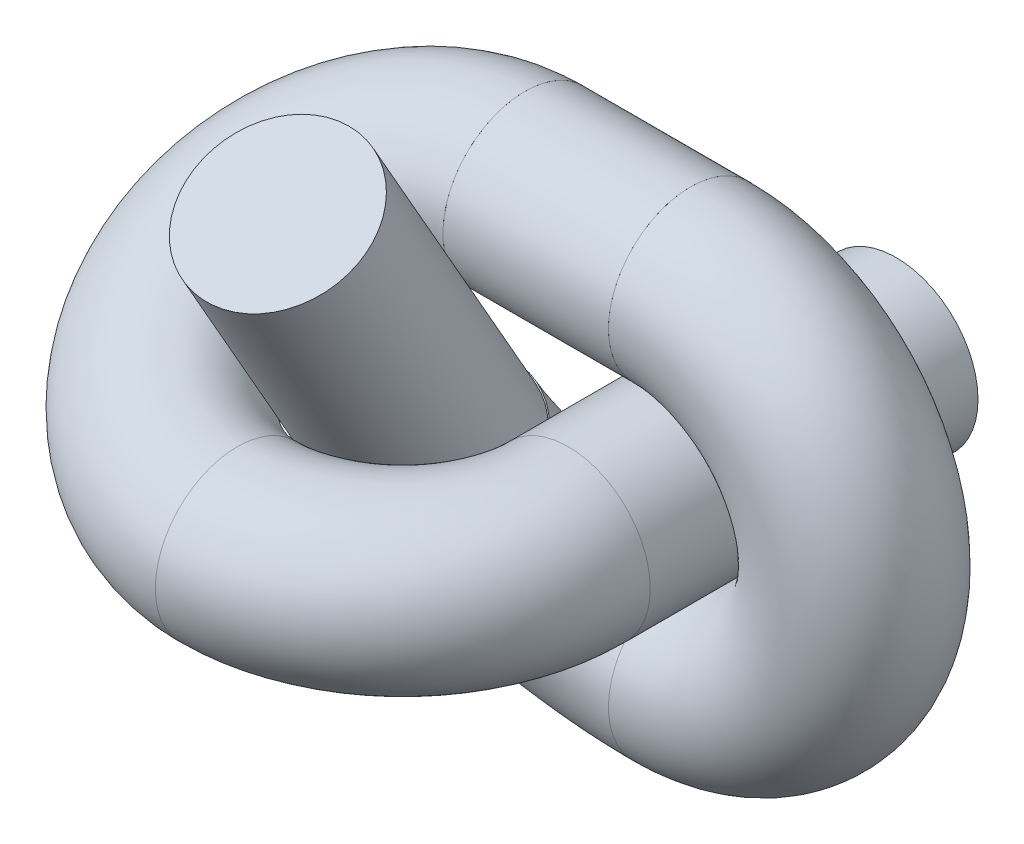
ISO-10303-21;
HEADER;
FILE_DESCRIPTION(('STEP AP214'),'2;1');
FILE_NAME('part.step','',(''),(''),'','','');
FILE_SCHEMA(('AUTOMOTIVE_DESIGN { 1 0 10303 214 1 1 1 1 }'));
ENDSEC;
DATA;
#1=APPLICATION_CONTEXT('core data for automotive mechanical design processes');
#2=APPLICATION_PROTOCOL_DEFINITION('international standard','automotive_design',2000,#1);
#3=PRODUCT_CONTEXT('',#1,'mechanical');
#4=PRODUCT('Part','Part','',(#3));
#5=PRODUCT_RELATED_PRODUCT_CATEGORY('part','',(#4));
#6=PRODUCT_DEFINITION_FORMATION('','',#4);
#7=PRODUCT_DEFINITION_CONTEXT('part definition',#1,'design');
#8=PRODUCT_DEFINITION('design','',#6,#7);
#9=PRODUCT_DEFINITION_SHAPE('','',#8);
#10=(LENGTH_UNIT() NAMED_UNIT(*) SI_UNIT(.MILLI.,.METRE.));
#11=(NAMED_UNIT(*) PLANE_ANGLE_UNIT() SI_UNIT($,.RADIAN.));
#12=(NAMED_UNIT(*) SI_UNIT($,.STERADIAN.) SOLID_ANGLE_UNIT());
#13=UNCERTAINTY_MEASURE_WITH_UNIT(LENGTH_MEASURE(1.E-05),#10,'distance_accuracy_value','');
#14=(GEOMETRIC_REPRESENTATION_CONTEXT(3) GLOBAL_UNCERTAINTY_ASSIGNED_CONTEXT((#13)) GLOBAL_UNIT_ASSIGNED_CONTEXT((#10,
#11,#12)) REPRESENTATION_CONTEXT('',''));
#15=CARTESIAN_POINT('',(0.,0.,0.));
#16=DIRECTION('',(0.,0.,1.));
#17=DIRECTION('',(1.,0.,0.));
#18=AXIS2_PLACEMENT_3D('',#15,#16,#17);
#19=CARTESIAN_POINT('',(-5.05,-0.662667760917116,8.86025271609244));
#20=DIRECTION('',(0.,0.868864769482725,0.495049504950495));
#21=DIRECTION('',(0.,-0.495049504950495,0.868864769482726));
#22=AXIS2_PLACEMENT_3D('',#19,#20,#21);
#23=CYLINDRICAL_SURFACE('',#22,2.5);
#24=CARTESIAN_POINT('',(-5.05,-0.662667760917116,8.86025271609244));
#25=DIRECTION('',(0.,-0.868864769482726,-0.495049504950495));
#26=DIRECTION('',(0.,0.495049504950495,-0.868864769482726));
#27=AXIS2_PLACEMENT_3D('',#24,#25,#26);
#28=CIRCLE('',#27,2.5);
#29=CARTESIAN_POINT('',(-5.05,0.574956001459122,6.68809079238562));
#30=VERTEX_POINT('',#29);
#31=EDGE_CURVE('E12',#30,#30,#28,.T.);
#32=ORIENTED_EDGE('',*,*,#31,.F.);
#33=EDGE_LOOP('',(#32));
#34=FACE_BOUND('',#33,.T.);
#35=CARTESIAN_POINT('',(-5.05,8.02597993391014,13.8107477655974));
#36=DIRECTION('',(0.,-0.868864769482726,-0.495049504950495));
#37=DIRECTION('',(0.,0.495049504950495,-0.868864769482726));
#38=AXIS2_PLACEMENT_3D('',#35,#36,#37);
#39=CIRCLE('',#38,2.5);
#40=CARTESIAN_POINT('',(-5.05,9.26360369628638,11.6385858418906));
#41=VERTEX_POINT('',#40);
#42=EDGE_CURVE('E57',#41,#41,#39,.T.);
#43=ORIENTED_EDGE('',*,*,#42,.T.);
#44=EDGE_LOOP('',(#43));
#45=FACE_BOUND('',#44,.T.);
#46=ADVANCED_FACE('F51',(#34,#45),#23,.T.);
#47=CARTESIAN_POINT('',(-5.05,-0.662667760917116,8.86025271609244));
#48=DIRECTION('',(0.,-0.868864769482726,-0.495049504950495));
#49=DIRECTION('',(0.,0.495049504950495,-0.868864769482726));
#50=AXIS2_PLACEMENT_3D('',#47,#48,#49);
#51=PLANE('',#50);
#52=ORIENTED_EDGE('',*,*,#31,.T.);
#53=EDGE_LOOP('',(#52));
#54=FACE_BOUND('',#53,.T.);
#55=ADVANCED_FACE('F66',(#54),#51,.T.);
#56=CARTESIAN_POINT('',(-5.05,8.02597993391014,13.8107477655974));
#57=DIRECTION('',(0.,-0.868864769482726,-0.495049504950495));
#58=DIRECTION('',(0.,0.495049504950495,-0.868864769482726));
#59=AXIS2_PLACEMENT_3D('',#56,#57,#58);
#60=PLANE('',#59);
#61=ORIENTED_EDGE('',*,*,#42,.F.);
#62=EDGE_LOOP('',(#61));
#63=FACE_BOUND('',#62,.T.);
#64=ADVANCED_FACE('F64',(#63),#60,.F.);
#65=CLOSED_SHELL('',(#46,#55,#64));
#66=MANIFOLD_SOLID_BREP('B2',#65);
#67=CARTESIAN_POINT('',(0.,5.,6.27446582822447));
#68=DIRECTION('',(1.,0.,0.));
#69=DIRECTION('',(0.,0.,-1.));
#70=AXIS2_PLACEMENT_3D('',#67,#68,#69);
#71=PLANE('',#70);
#72=CARTESIAN_POINT('',(0.,5.,6.27446582822447));
#73=DIRECTION('',(1.,0.,0.));
#74=DIRECTION('',(0.,0.,-1.));
#75=AXIS2_PLACEMENT_3D('',#72,#73,#74);
#76=CIRCLE('',#75,2.5);
#77=CARTESIAN_POINT('',(0.,7.5,6.27446582822447));
#78=VERTEX_POINT('',#77);
#79=EDGE_CURVE('E106',#78,#78,#76,.T.);
#80=ORIENTED_EDGE('',*,*,#79,.F.);
#81=EDGE_LOOP('',(#80));
#82=FACE_BOUND('',#81,.T.);
#83=ADVANCED_FACE('F100',(#82),#71,.F.);
#84=CARTESIAN_POINT('',(0.,0.,6.27446582822447));
#85=DIRECTION('',(0.,0.,-1.));
#86=DIRECTION('',(-1.,0.,0.));
#87=AXIS2_PLACEMENT_3D('',#84,#85,#86);
#88=TOROIDAL_SURFACE('',#87,5.,2.5);
#89=CARTESIAN_POINT('',(0.,-5.,6.27446582822447));
#90=DIRECTION('',(-1.,0.,0.));
#91=DIRECTION('',(0.,0.,-1.));
#92=AXIS2_PLACEMENT_3D('',#89,#90,#91);
#93=CIRCLE('',#92,2.5);
#94=CARTESIAN_POINT('',(0.,-7.5,6.27446582822447));
#95=VERTEX_POINT('',#94);
#96=EDGE_CURVE('E50',#95,#95,#93,.T.);
#97=CARTESIAN_POINT('',(0.,0.,6.27446582822447));
#98=DIRECTION('',(0.,0.,-1.));
#99=DIRECTION('',(-1.,0.,0.));
#100=AXIS2_PLACEMENT_3D('',#97,#98,#99);
#101=CIRCLE('',#100,7.5);
#102=EDGE_CURVE('',#78,#95,#101,.T.);
#103=ORIENTED_EDGE('',*,*,#79,.T.);
#104=ORIENTED_EDGE('',*,*,#96,.F.);
#105=ORIENTED_EDGE('',*,*,#102,.T.);
#106=ORIENTED_EDGE('',*,*,#102,.F.);
#107=EDGE_LOOP('',(#103,#105,#104,#106));
#108=FACE_BOUND('',#107,.T.);
#109=ADVANCED_FACE('F125',(#108),#88,.T.);
#110=CARTESIAN_POINT('',(-5.05,-0.64114948311499,8.82454860559686));
#111=DIRECTION('',(0.,0.863138716214854,0.504966886608394));
#112=DIRECTION('',(-0.863138716214853,-0.254991556570975,0.435856470238181));
#113=AXIS2_PLACEMENT_3D('',#110,#111,#112);
#114=PLANE('',#113);
#115=CARTESIAN_POINT('',(-5.05,-0.64114948311499,8.82454860559686));
#116=DIRECTION('',(0.,0.863138716214854,0.504966886608394));
#117=DIRECTION('',(-0.863138716214853,-0.254991556570975,0.435856470238181));
#118=AXIS2_PLACEMENT_3D('',#115,#116,#117);
#119=CIRCLE('',#118,2.5);
#120=CARTESIAN_POINT('',(-7.20784679053713,-1.27862837454243,9.91418978119231));
#121=VERTEX_POINT('',#120);
#122=EDGE_CURVE('E110',#121,#121,#119,.T.);
#123=ORIENTED_EDGE('',*,*,#122,.T.);
#124=EDGE_LOOP('',(#123));
#125=FACE_BOUND('',#124,.T.);
#126=ADVANCED_FACE('F117',(#125),#114,.T.);
#127=CARTESIAN_POINT('',(0.,-0.64114948311499,8.82454860559686));
#128=DIRECTION('',(0.,-0.504966886608394,0.863138716214854));
#129=DIRECTION('',(0.,-0.863138716214854,-0.504966886608394));
#130=AXIS2_PLACEMENT_3D('',#127,#128,#129);
#131=TOROIDAL_SURFACE('',#130,5.05,2.5);
#132=ORIENTED_EDGE('',*,*,#96,.T.);
#133=EDGE_LOOP('',(#132));
#134=FACE_BOUND('',#133,.T.);
#135=ORIENTED_EDGE('',*,*,#122,.F.);
#136=EDGE_LOOP('',(#135));
#137=FACE_BOUND('',#136,.T.);
#138=ADVANCED_FACE('F119',(#134,#137),#131,.T.);
#139=CLOSED_SHELL('',(#83,#109,#126,#138));
#140=MANIFOLD_SOLID_BREP('B7',#139);
#141=CARTESIAN_POINT('',(-5.05,5.,6.27446582822447));
#142=DIRECTION('',(1.,0.,0.));
#143=DIRECTION('',(0.,0.,-1.));
#144=AXIS2_PLACEMENT_3D('',#141,#142,#143);
#145=CYLINDRICAL_SURFACE('',#144,2.5);
#146=CARTESIAN_POINT('',(-5.05,5.,6.27446582822447));
#147=DIRECTION('',(1.,0.,0.));
#148=DIRECTION('',(0.,0.,-1.));
#149=AXIS2_PLACEMENT_3D('',#146,#147,#148);
#150=CIRCLE('',#149,2.5);
#151=CARTESIAN_POINT('',(-5.05,5.,3.77446582822447));
#152=VERTEX_POINT('',#151);
#153=EDGE_CURVE('E99',#152,#152,#150,.T.);
#154=ORIENTED_EDGE('',*,*,#153,.T.);
#155=EDGE_LOOP('',(#154));
#156=FACE_BOUND('',#155,.T.);
#157=CARTESIAN_POINT('',(0.,5.,6.27446582822447));
#158=DIRECTION('',(1.,0.,0.));
#159=DIRECTION('',(0.,0.,-1.));
#160=AXIS2_PLACEMENT_3D('',#157,#158,#159);
#161=CIRCLE('',#160,2.5);
#162=CARTESIAN_POINT('',(0.,5.,3.77446582822447));
#163=VERTEX_POINT('',#162);
#164=EDGE_CURVE('E166',#163,#163,#161,.T.);
#165=ORIENTED_EDGE('',*,*,#164,.F.);
#166=EDGE_LOOP('',(#165));
#167=FACE_BOUND('',#166,.T.);
#168=ADVANCED_FACE('F163',(#156,#167),#145,.T.);
#169=CARTESIAN_POINT('',(-5.05,5.,6.27446582822447));
#170=DIRECTION('',(1.,0.,0.));
#171=DIRECTION('',(0.,0.,-1.));
#172=AXIS2_PLACEMENT_3D('',#169,#170,#171);
#173=PLANE('',#172);
#174=ORIENTED_EDGE('',*,*,#153,.F.);
#175=EDGE_LOOP('',(#174));
#176=FACE_BOUND('',#175,.T.);
#177=ADVANCED_FACE('F178',(#176),#173,.F.);
#178=CARTESIAN_POINT('',(0.,5.,6.27446582822447));
#179=DIRECTION('',(1.,0.,0.));
#180=DIRECTION('',(0.,0.,-1.));
#181=AXIS2_PLACEMENT_3D('',#178,#179,#180);
#182=PLANE('',#181);
#183=ORIENTED_EDGE('',*,*,#164,.T.);
#184=EDGE_LOOP('',(#183));
#185=FACE_BOUND('',#184,.T.);
#186=ADVANCED_FACE('F175',(#185),#182,.T.);
#187=CLOSED_SHELL('',(#168,#177,#186));
#188=MANIFOLD_SOLID_BREP('B45',#187);
#189=CARTESIAN_POINT('',(0.,0.,10.));
#190=DIRECTION('',(0.,0.,-1.));
#191=DIRECTION('',(-1.,0.,0.));
#192=AXIS2_PLACEMENT_3D('',#189,#190,#191);
#193=CYLINDRICAL_SURFACE('',#192,2.5);
#194=CARTESIAN_POINT('',(0.,0.,10.));
#195=DIRECTION('',(0.,0.,1.));
#196=DIRECTION('',(1.,0.,0.));
#197=AXIS2_PLACEMENT_3D('',#194,#195,#196);
#198=CIRCLE('',#197,2.5);
#199=CARTESIAN_POINT('',(2.5,0.,10.));
#200=VERTEX_POINT('',#199);
#201=EDGE_CURVE('E162',#200,#200,#198,.T.);
#202=ORIENTED_EDGE('',*,*,#201,.F.);
#203=EDGE_LOOP('',(#202));
#204=FACE_BOUND('',#203,.T.);
#205=CARTESIAN_POINT('',(0.,0.,0.));
#206=DIRECTION('',(0.,0.,1.));
#207=DIRECTION('',(1.,0.,0.));
#208=AXIS2_PLACEMENT_3D('',#205,#206,#207);
#209=CIRCLE('',#208,2.5);
#210=CARTESIAN_POINT('',(2.5,0.,0.));
#211=VERTEX_POINT('',#210);
#212=EDGE_CURVE('E212',#211,#211,#209,.T.);
#213=ORIENTED_EDGE('',*,*,#212,.T.);
#214=EDGE_LOOP('',(#213));
#215=FACE_BOUND('',#214,.T.);
#216=ADVANCED_FACE('F204',(#204,#215),#193,.T.);
#217=CARTESIAN_POINT('',(0.,0.,0.));
#218=DIRECTION('',(0.,0.,1.));
#219=DIRECTION('',(1.,0.,0.));
#220=AXIS2_PLACEMENT_3D('',#217,#218,#219);
#221=PLANE('',#220);
#222=ORIENTED_EDGE('',*,*,#212,.F.);
#223=EDGE_LOOP('',(#222));
#224=FACE_BOUND('',#223,.T.);
#225=ADVANCED_FACE('F233',(#224),#221,.F.);
#226=CARTESIAN_POINT('',(-5.05,0.,10.));
#227=DIRECTION('',(0.,1.,0.));
#228=DIRECTION('',(0.,0.,1.));
#229=AXIS2_PLACEMENT_3D('',#226,#227,#228);
#230=TOROIDAL_SURFACE('',#229,5.05,2.5);
#231=CARTESIAN_POINT('',(-5.05,0.,15.05));
#232=DIRECTION('',(-1.,0.,0.));
#233=DIRECTION('',(0.,0.,1.));
#234=AXIS2_PLACEMENT_3D('',#231,#232,#233);
#235=CIRCLE('',#234,2.5);
#236=CARTESIAN_POINT('',(-5.05,0.,17.55));
#237=VERTEX_POINT('',#236);
#238=EDGE_CURVE('E207',#237,#237,#235,.T.);
#239=CARTESIAN_POINT('',(-5.05,0.,10.));
#240=DIRECTION('',(0.,1.,0.));
#241=DIRECTION('',(0.,0.,1.));
#242=AXIS2_PLACEMENT_3D('',#239,#240,#241);
#243=CIRCLE('',#242,7.55);
#244=EDGE_CURVE('',#237,#200,#243,.T.);
#245=ORIENTED_EDGE('',*,*,#238,.F.);
#246=ORIENTED_EDGE('',*,*,#201,.T.);
#247=ORIENTED_EDGE('',*,*,#244,.T.);
#248=ORIENTED_EDGE('',*,*,#244,.F.);
#249=EDGE_LOOP('',(#245,#247,#246,#248));
#250=FACE_BOUND('',#249,.T.);
#251=ADVANCED_FACE('F230',(#250),#230,.T.);
#252=CARTESIAN_POINT('',(-5.05,5.,6.27446582822447));
#253=DIRECTION('',(1.,0.,0.));
#254=DIRECTION('',(0.,0.860262148002699,-0.509851975296539));
#255=AXIS2_PLACEMENT_3D('',#252,#253,#254);
#256=PLANE('',#255);
#257=CARTESIAN_POINT('',(-5.05,5.,6.27446582822447));
#258=DIRECTION('',(1.,0.,0.));
#259=DIRECTION('',(0.,0.860262148002699,-0.509851975296539));
#260=AXIS2_PLACEMENT_3D('',#257,#258,#259);
#261=CIRCLE('',#260,2.5);
#262=CARTESIAN_POINT('',(-5.05,7.15065537000675,4.99983588998313));
#263=VERTEX_POINT('',#262);
#264=EDGE_CURVE('E219',#263,#263,#261,.T.);
#265=ORIENTED_EDGE('',*,*,#264,.T.);
#266=EDGE_LOOP('',(#265));
#267=FACE_BOUND('',#266,.T.);
#268=ADVANCED_FACE('F232',(#267),#256,.T.);
#269=CARTESIAN_POINT('',(-5.05,2.5,10.6622329141122));
#270=DIRECTION('',(0.,-0.868864769482726,-0.495049504950495));
#271=DIRECTION('',(0.,0.495049504950495,-0.868864769482726));
#272=AXIS2_PLACEMENT_3D('',#269,#270,#271);
#273=TOROIDAL_SURFACE('',#272,5.05,2.5);
#274=ORIENTED_EDGE('',*,*,#264,.F.);
#275=EDGE_LOOP('',(#274));
#276=FACE_BOUND('',#275,.T.);
#277=ORIENTED_EDGE('',*,*,#238,.T.);
#278=EDGE_LOOP('',(#277));
#279=FACE_BOUND('',#278,.T.);
#280=ADVANCED_FACE('F228',(#276,#279),#273,.T.);
#281=CLOSED_SHELL('',(#216,#225,#251,#268,#280));
#282=MANIFOLD_SOLID_BREP('B94',#281);
#283=ADVANCED_BREP_SHAPE_REPRESENTATION('',(#18,#66,#140,#188,#282),#14);
#284=SHAPE_DEFINITION_REPRESENTATION(#9,#283);
ENDSEC;
END-ISO-10303-21;
